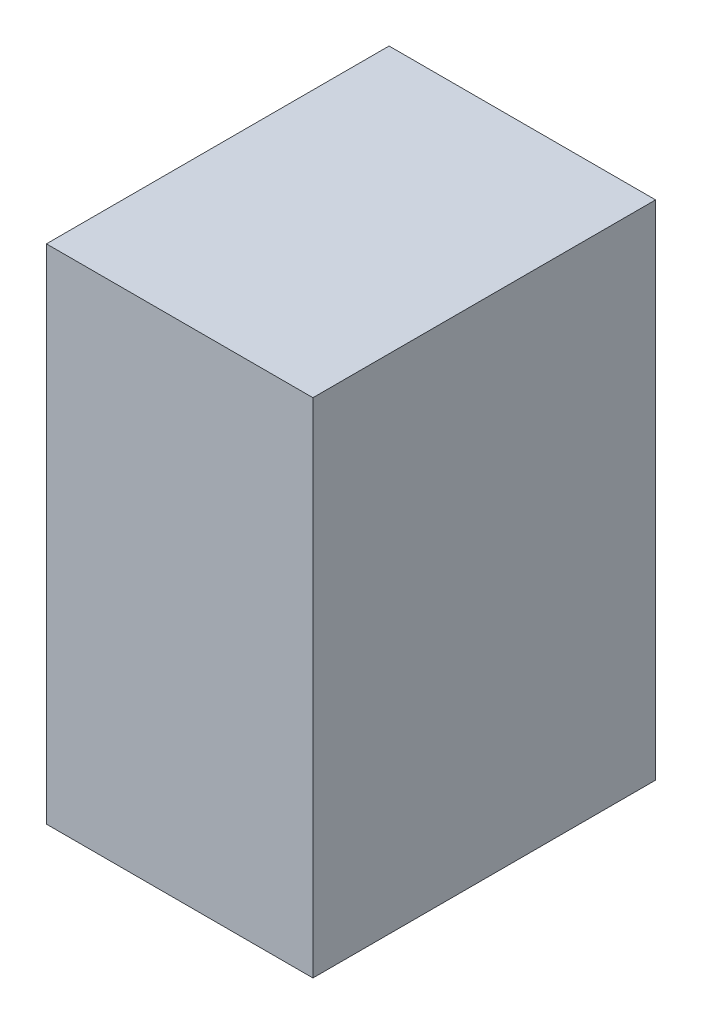
ISO-10303-21;
HEADER;
FILE_DESCRIPTION(('STEP AP214'),'2;1');
FILE_NAME('part.step','',(''),(''),'','','');
FILE_SCHEMA(('AUTOMOTIVE_DESIGN { 1 0 10303 214 1 1 1 1 }'));
ENDSEC;
DATA;
#1=APPLICATION_CONTEXT('core data for automotive mechanical design processes');
#2=APPLICATION_PROTOCOL_DEFINITION('international standard','automotive_design',2000,#1);
#3=PRODUCT_CONTEXT('',#1,'mechanical');
#4=PRODUCT('Part','Part','',(#3));
#5=PRODUCT_RELATED_PRODUCT_CATEGORY('part','',(#4));
#6=PRODUCT_DEFINITION_FORMATION('','',#4);
#7=PRODUCT_DEFINITION_CONTEXT('part definition',#1,'design');
#8=PRODUCT_DEFINITION('design','',#6,#7);
#9=PRODUCT_DEFINITION_SHAPE('','',#8);
#10=(LENGTH_UNIT() NAMED_UNIT(*) SI_UNIT(.MILLI.,.METRE.));
#11=(NAMED_UNIT(*) PLANE_ANGLE_UNIT() SI_UNIT($,.RADIAN.));
#12=(NAMED_UNIT(*) SI_UNIT($,.STERADIAN.) SOLID_ANGLE_UNIT());
#13=UNCERTAINTY_MEASURE_WITH_UNIT(LENGTH_MEASURE(1.E-05),#10,'distance_accuracy_value','');
#14=(GEOMETRIC_REPRESENTATION_CONTEXT(3) GLOBAL_UNCERTAINTY_ASSIGNED_CONTEXT((#13)) GLOBAL_UNIT_ASSIGNED_CONTEXT((#10,
#11,#12)) REPRESENTATION_CONTEXT('',''));
#15=CARTESIAN_POINT('',(0.,0.,0.));
#16=DIRECTION('',(0.,0.,1.));
#17=DIRECTION('',(1.,0.,0.));
#18=AXIS2_PLACEMENT_3D('',#15,#16,#17);
#19=CARTESIAN_POINT('',(16.25,-7.9,-0.5));
#20=DIRECTION('',(1.,0.,0.));
#21=DIRECTION('',(0.,1.,0.));
#22=AXIS2_PLACEMENT_3D('',#19,#20,#21);
#23=PLANE('',#22);
#24=DIRECTION('',(0.,0.,1.));
#25=VECTOR('',#24,1.);
#26=CARTESIAN_POINT('',(16.25,-8.1,-0.5));
#27=LINE('',#26,#25);
#28=CARTESIAN_POINT('',(16.25,-8.1,-4.5));
#29=VERTEX_POINT('',#28);
#30=CARTESIAN_POINT('',(16.25,-8.1,-0.5));
#31=VERTEX_POINT('',#30);
#32=EDGE_CURVE('E187',#29,#31,#27,.T.);
#33=ORIENTED_EDGE('',*,*,#32,.T.);
#34=DIRECTION('',(0.,1.,0.));
#35=VECTOR('',#34,1.);
#36=CARTESIAN_POINT('',(16.25,-7.9,-0.5));
#37=LINE('',#36,#35);
#38=CARTESIAN_POINT('',(16.25,-7.9,-0.5));
#39=VERTEX_POINT('',#38);
#40=EDGE_CURVE('E20',#39,#31,#37,.F.);
#41=ORIENTED_EDGE('',*,*,#40,.F.);
#42=DIRECTION('',(0.,0.,1.));
#43=VECTOR('',#42,1.);
#44=CARTESIAN_POINT('',(16.25,-7.9,-0.5));
#45=LINE('',#44,#43);
#46=CARTESIAN_POINT('',(16.25,-7.9,-4.5));
#47=VERTEX_POINT('',#46);
#48=EDGE_CURVE('E197',#39,#47,#45,.F.);
#49=ORIENTED_EDGE('',*,*,#48,.T.);
#50=DIRECTION('',(0.,1.,0.));
#51=VECTOR('',#50,1.);
#52=CARTESIAN_POINT('',(16.25,-7.9,-4.5));
#53=LINE('',#52,#51);
#54=EDGE_CURVE('E185',#29,#47,#53,.T.);
#55=ORIENTED_EDGE('',*,*,#54,.F.);
#56=EDGE_LOOP('',(#33,#41,#49,#55));
#57=FACE_BOUND('',#56,.T.);
#58=ADVANCED_FACE('F17',(#57),#23,.F.);
#59=CARTESIAN_POINT('',(16.25,-6.7,-0.5));
#60=DIRECTION('',(1.,0.,0.));
#61=DIRECTION('',(0.,1.,0.));
#62=AXIS2_PLACEMENT_3D('',#59,#60,#61);
#63=PLANE('',#62);
#64=DIRECTION('',(0.,0.,1.));
#65=VECTOR('',#64,1.);
#66=CARTESIAN_POINT('',(16.25,-6.9,-0.5));
#67=LINE('',#66,#65);
#68=CARTESIAN_POINT('',(16.25,-6.9,-4.5));
#69=VERTEX_POINT('',#68);
#70=CARTESIAN_POINT('',(16.25,-6.9,-0.5));
#71=VERTEX_POINT('',#70);
#72=EDGE_CURVE('E224',#69,#71,#67,.T.);
#73=ORIENTED_EDGE('',*,*,#72,.T.);
#74=DIRECTION('',(0.,1.,0.));
#75=VECTOR('',#74,1.);
#76=CARTESIAN_POINT('',(16.25,-6.7,-0.5));
#77=LINE('',#76,#75);
#78=CARTESIAN_POINT('',(16.25,-6.7,-0.5));
#79=VERTEX_POINT('',#78);
#80=EDGE_CURVE('E210',#79,#71,#77,.F.);
#81=ORIENTED_EDGE('',*,*,#80,.F.);
#82=DIRECTION('',(0.,0.,1.));
#83=VECTOR('',#82,1.);
#84=CARTESIAN_POINT('',(16.25,-6.7,-0.5));
#85=LINE('',#84,#83);
#86=CARTESIAN_POINT('',(16.25,-6.7,-4.5));
#87=VERTEX_POINT('',#86);
#88=EDGE_CURVE('E233',#79,#87,#85,.F.);
#89=ORIENTED_EDGE('',*,*,#88,.T.);
#90=DIRECTION('',(0.,1.,0.));
#91=VECTOR('',#90,1.);
#92=CARTESIAN_POINT('',(16.25,-6.7,-4.5));
#93=LINE('',#92,#91);
#94=EDGE_CURVE('E208',#69,#87,#93,.T.);
#95=ORIENTED_EDGE('',*,*,#94,.F.);
#96=EDGE_LOOP('',(#73,#81,#89,#95));
#97=FACE_BOUND('',#96,.T.);
#98=ADVANCED_FACE('F638',(#97),#63,.F.);
#99=CARTESIAN_POINT('',(16.25,-5.5,-0.5));
#100=DIRECTION('',(1.,0.,0.));
#101=DIRECTION('',(0.,1.,0.));
#102=AXIS2_PLACEMENT_3D('',#99,#100,#101);
#103=PLANE('',#102);
#104=DIRECTION('',(0.,0.,1.));
#105=VECTOR('',#104,1.);
#106=CARTESIAN_POINT('',(16.25,-5.7,-0.5));
#107=LINE('',#106,#105);
#108=CARTESIAN_POINT('',(16.25,-5.7,-4.5));
#109=VERTEX_POINT('',#108);
#110=CARTESIAN_POINT('',(16.25,-5.7,-0.5));
#111=VERTEX_POINT('',#110);
#112=EDGE_CURVE('E241',#109,#111,#107,.T.);
#113=ORIENTED_EDGE('',*,*,#112,.T.);
#114=DIRECTION('',(0.,1.,0.));
#115=VECTOR('',#114,1.);
#116=CARTESIAN_POINT('',(16.25,-5.5,-0.5));
#117=LINE('',#116,#115);
#118=CARTESIAN_POINT('',(16.25,-5.5,-0.5));
#119=VERTEX_POINT('',#118);
#120=EDGE_CURVE('E206',#119,#111,#117,.F.);
#121=ORIENTED_EDGE('',*,*,#120,.F.);
#122=DIRECTION('',(0.,0.,1.));
#123=VECTOR('',#122,1.);
#124=CARTESIAN_POINT('',(16.25,-5.5,-0.5));
#125=LINE('',#124,#123);
#126=CARTESIAN_POINT('',(16.25,-5.5,-4.5));
#127=VERTEX_POINT('',#126);
#128=EDGE_CURVE('E248',#119,#127,#125,.F.);
#129=ORIENTED_EDGE('',*,*,#128,.T.);
#130=DIRECTION('',(0.,1.,0.));
#131=VECTOR('',#130,1.);
#132=CARTESIAN_POINT('',(16.25,-5.5,-4.5));
#133=LINE('',#132,#131);
#134=EDGE_CURVE('E204',#109,#127,#133,.T.);
#135=ORIENTED_EDGE('',*,*,#134,.F.);
#136=EDGE_LOOP('',(#113,#121,#129,#135));
#137=FACE_BOUND('',#136,.T.);
#138=ADVANCED_FACE('F629',(#137),#103,.F.);
#139=CARTESIAN_POINT('',(16.25,-4.3,-0.5));
#140=DIRECTION('',(1.,0.,0.));
#141=DIRECTION('',(0.,1.,0.));
#142=AXIS2_PLACEMENT_3D('',#139,#140,#141);
#143=PLANE('',#142);
#144=DIRECTION('',(0.,0.,1.));
#145=VECTOR('',#144,1.);
#146=CARTESIAN_POINT('',(16.25,-4.5,-0.5));
#147=LINE('',#146,#145);
#148=CARTESIAN_POINT('',(16.25,-4.5,-4.5));
#149=VERTEX_POINT('',#148);
#150=CARTESIAN_POINT('',(16.25,-4.5,-0.5));
#151=VERTEX_POINT('',#150);
#152=EDGE_CURVE('E256',#149,#151,#147,.T.);
#153=ORIENTED_EDGE('',*,*,#152,.T.);
#154=DIRECTION('',(0.,1.,0.));
#155=VECTOR('',#154,1.);
#156=CARTESIAN_POINT('',(16.25,-4.3,-0.5));
#157=LINE('',#156,#155);
#158=CARTESIAN_POINT('',(16.25,-4.3,-0.5));
#159=VERTEX_POINT('',#158);
#160=EDGE_CURVE('E202',#159,#151,#157,.F.);
#161=ORIENTED_EDGE('',*,*,#160,.F.);
#162=DIRECTION('',(0.,0.,1.));
#163=VECTOR('',#162,1.);
#164=CARTESIAN_POINT('',(16.25,-4.3,-0.5));
#165=LINE('',#164,#163);
#166=CARTESIAN_POINT('',(16.25,-4.3,-4.5));
#167=VERTEX_POINT('',#166);
#168=EDGE_CURVE('E263',#159,#167,#165,.F.);
#169=ORIENTED_EDGE('',*,*,#168,.T.);
#170=DIRECTION('',(0.,1.,0.));
#171=VECTOR('',#170,1.);
#172=CARTESIAN_POINT('',(16.25,-4.3,-4.5));
#173=LINE('',#172,#171);
#174=EDGE_CURVE('E190',#149,#167,#173,.T.);
#175=ORIENTED_EDGE('',*,*,#174,.F.);
#176=EDGE_LOOP('',(#153,#161,#169,#175));
#177=FACE_BOUND('',#176,.T.);
#178=ADVANCED_FACE('F621',(#177),#143,.F.);
#179=CARTESIAN_POINT('',(16.25,-8.1,-0.5));
#180=DIRECTION('',(0.,1.,0.));
#181=DIRECTION('',(0.,0.,1.));
#182=AXIS2_PLACEMENT_3D('',#179,#180,#181);
#183=PLANE('',#182);
#184=DIRECTION('',(0.,0.,1.));
#185=VECTOR('',#184,1.);
#186=CARTESIAN_POINT('',(17.25,-8.1,-0.5));
#187=LINE('',#186,#185);
#188=CARTESIAN_POINT('',(17.25,-8.1,-4.5));
#189=VERTEX_POINT('',#188);
#190=CARTESIAN_POINT('',(17.25,-8.1,-0.5));
#191=VERTEX_POINT('',#190);
#192=EDGE_CURVE('E194',#189,#191,#187,.T.);
#193=ORIENTED_EDGE('',*,*,#192,.T.);
#194=DIRECTION('',(1.,0.,0.));
#195=VECTOR('',#194,1.);
#196=CARTESIAN_POINT('',(16.25,-8.1,-0.5));
#197=LINE('',#196,#195);
#198=EDGE_CURVE('E180',#31,#191,#197,.T.);
#199=ORIENTED_EDGE('',*,*,#198,.F.);
#200=ORIENTED_EDGE('',*,*,#32,.F.);
#201=DIRECTION('',(1.,0.,0.));
#202=VECTOR('',#201,1.);
#203=CARTESIAN_POINT('',(0.,-8.1,-4.5));
#204=LINE('',#203,#202);
#205=EDGE_CURVE('E218',#29,#189,#204,.T.);
#206=ORIENTED_EDGE('',*,*,#205,.T.);
#207=EDGE_LOOP('',(#193,#199,#200,#206));
#208=FACE_BOUND('',#207,.T.);
#209=ADVANCED_FACE('F192',(#208),#183,.F.);
#210=CARTESIAN_POINT('',(17.25,-7.9,-0.5));
#211=DIRECTION('',(0.,-1.,0.));
#212=DIRECTION('',(1.,0.,0.));
#213=AXIS2_PLACEMENT_3D('',#210,#211,#212);
#214=PLANE('',#213);
#215=ORIENTED_EDGE('',*,*,#48,.F.);
#216=DIRECTION('',(1.,0.,0.));
#217=VECTOR('',#216,1.);
#218=CARTESIAN_POINT('',(17.25,-7.9,-0.5));
#219=LINE('',#218,#217);
#220=CARTESIAN_POINT('',(17.25,-7.9,-0.5));
#221=VERTEX_POINT('',#220);
#222=EDGE_CURVE('E175',#221,#39,#219,.F.);
#223=ORIENTED_EDGE('',*,*,#222,.F.);
#224=DIRECTION('',(0.,0.,1.));
#225=VECTOR('',#224,1.);
#226=CARTESIAN_POINT('',(17.25,-7.9,-0.5));
#227=LINE('',#226,#225);
#228=CARTESIAN_POINT('',(17.25,-7.9,-4.5));
#229=VERTEX_POINT('',#228);
#230=EDGE_CURVE('E222',#221,#229,#227,.F.);
#231=ORIENTED_EDGE('',*,*,#230,.T.);
#232=DIRECTION('',(1.,0.,0.));
#233=VECTOR('',#232,1.);
#234=CARTESIAN_POINT('',(0.,-7.9,-4.5));
#235=LINE('',#234,#233);
#236=EDGE_CURVE('E216',#229,#47,#235,.F.);
#237=ORIENTED_EDGE('',*,*,#236,.T.);
#238=EDGE_LOOP('',(#215,#223,#231,#237));
#239=FACE_BOUND('',#238,.T.);
#240=ADVANCED_FACE('F220',(#239),#214,.F.);
#241=CARTESIAN_POINT('',(0.,0.,-4.5));
#242=DIRECTION('',(0.,0.,1.));
#243=DIRECTION('',(1.,0.,0.));
#244=AXIS2_PLACEMENT_3D('',#241,#242,#243);
#245=PLANE('',#244);
#246=ORIENTED_EDGE('',*,*,#205,.F.);
#247=ORIENTED_EDGE('',*,*,#54,.T.);
#248=ORIENTED_EDGE('',*,*,#236,.F.);
#249=DIRECTION('',(0.,-1.,0.));
#250=VECTOR('',#249,1.);
#251=CARTESIAN_POINT('',(17.25,-8.1,-4.5));
#252=LINE('',#251,#250);
#253=EDGE_CURVE('E273',#229,#189,#252,.T.);
#254=ORIENTED_EDGE('',*,*,#253,.T.);
#255=EDGE_LOOP('',(#246,#247,#248,#254));
#256=FACE_BOUND('',#255,.T.);
#257=ADVANCED_FACE('F213',(#256),#245,.F.);
#258=CARTESIAN_POINT('',(16.25,-6.9,-0.5));
#259=DIRECTION('',(0.,1.,0.));
#260=DIRECTION('',(-1.,0.,0.));
#261=AXIS2_PLACEMENT_3D('',#258,#259,#260);
#262=PLANE('',#261);
#263=DIRECTION('',(0.,0.,1.));
#264=VECTOR('',#263,1.);
#265=CARTESIAN_POINT('',(17.25,-6.9,-0.5));
#266=LINE('',#265,#264);
#267=CARTESIAN_POINT('',(17.25,-6.9,-4.5));
#268=VERTEX_POINT('',#267);
#269=CARTESIAN_POINT('',(17.25,-6.9,-0.5));
#270=VERTEX_POINT('',#269);
#271=EDGE_CURVE('E275',#268,#270,#266,.T.);
#272=ORIENTED_EDGE('',*,*,#271,.T.);
#273=DIRECTION('',(-1.,0.,0.));
#274=VECTOR('',#273,1.);
#275=CARTESIAN_POINT('',(16.25,-6.9,-0.5));
#276=LINE('',#275,#274);
#277=EDGE_CURVE('E229',#71,#270,#276,.F.);
#278=ORIENTED_EDGE('',*,*,#277,.F.);
#279=ORIENTED_EDGE('',*,*,#72,.F.);
#280=DIRECTION('',(1.,0.,0.));
#281=VECTOR('',#280,1.);
#282=CARTESIAN_POINT('',(0.,-6.9,-4.5));
#283=LINE('',#282,#281);
#284=EDGE_CURVE('E239',#69,#268,#283,.T.);
#285=ORIENTED_EDGE('',*,*,#284,.T.);
#286=EDGE_LOOP('',(#272,#278,#279,#285));
#287=FACE_BOUND('',#286,.T.);
#288=ADVANCED_FACE('F590',(#287),#262,.F.);
#289=CARTESIAN_POINT('',(17.25,-6.7,-0.5));
#290=DIRECTION('',(0.,-1.,0.));
#291=DIRECTION('',(1.,0.,0.));
#292=AXIS2_PLACEMENT_3D('',#289,#290,#291);
#293=PLANE('',#292);
#294=ORIENTED_EDGE('',*,*,#88,.F.);
#295=DIRECTION('',(1.,0.,0.));
#296=VECTOR('',#295,1.);
#297=CARTESIAN_POINT('',(17.25,-6.7,-0.5));
#298=LINE('',#297,#296);
#299=CARTESIAN_POINT('',(17.25,-6.7,-0.5));
#300=VERTEX_POINT('',#299);
#301=EDGE_CURVE('E231',#300,#79,#298,.F.);
#302=ORIENTED_EDGE('',*,*,#301,.F.);
#303=DIRECTION('',(0.,0.,1.));
#304=VECTOR('',#303,1.);
#305=CARTESIAN_POINT('',(17.25,-6.7,-0.5));
#306=LINE('',#305,#304);
#307=CARTESIAN_POINT('',(17.25,-6.7,-4.5));
#308=VERTEX_POINT('',#307);
#309=EDGE_CURVE('E278',#300,#308,#306,.F.);
#310=ORIENTED_EDGE('',*,*,#309,.T.);
#311=DIRECTION('',(1.,0.,0.));
#312=VECTOR('',#311,1.);
#313=CARTESIAN_POINT('',(0.,-6.7,-4.5));
#314=LINE('',#313,#312);
#315=EDGE_CURVE('E236',#308,#87,#314,.F.);
#316=ORIENTED_EDGE('',*,*,#315,.T.);
#317=EDGE_LOOP('',(#294,#302,#310,#316));
#318=FACE_BOUND('',#317,.T.);
#319=ADVANCED_FACE('F581',(#318),#293,.F.);
#320=CARTESIAN_POINT('',(0.,0.,-4.5));
#321=DIRECTION('',(0.,0.,1.));
#322=DIRECTION('',(1.,0.,0.));
#323=AXIS2_PLACEMENT_3D('',#320,#321,#322);
#324=PLANE('',#323);
#325=ORIENTED_EDGE('',*,*,#284,.F.);
#326=ORIENTED_EDGE('',*,*,#94,.T.);
#327=ORIENTED_EDGE('',*,*,#315,.F.);
#328=DIRECTION('',(0.,-1.,0.));
#329=VECTOR('',#328,1.);
#330=CARTESIAN_POINT('',(17.25,-6.9,-4.5));
#331=LINE('',#330,#329);
#332=EDGE_CURVE('E280',#308,#268,#331,.T.);
#333=ORIENTED_EDGE('',*,*,#332,.T.);
#334=EDGE_LOOP('',(#325,#326,#327,#333));
#335=FACE_BOUND('',#334,.T.);
#336=ADVANCED_FACE('F572',(#335),#324,.F.);
#337=CARTESIAN_POINT('',(16.25,-5.7,-0.5));
#338=DIRECTION('',(0.,1.,0.));
#339=DIRECTION('',(-1.,0.,0.));
#340=AXIS2_PLACEMENT_3D('',#337,#338,#339);
#341=PLANE('',#340);
#342=DIRECTION('',(0.,0.,1.));
#343=VECTOR('',#342,1.);
#344=CARTESIAN_POINT('',(17.25,-5.7,-0.5));
#345=LINE('',#344,#343);
#346=CARTESIAN_POINT('',(17.25,-5.7,-4.5));
#347=VERTEX_POINT('',#346);
#348=CARTESIAN_POINT('',(17.25,-5.7,-0.5));
#349=VERTEX_POINT('',#348);
#350=EDGE_CURVE('E283',#347,#349,#345,.T.);
#351=ORIENTED_EDGE('',*,*,#350,.T.);
#352=DIRECTION('',(-1.,0.,0.));
#353=VECTOR('',#352,1.);
#354=CARTESIAN_POINT('',(16.25,-5.7,-0.5));
#355=LINE('',#354,#353);
#356=EDGE_CURVE('E244',#111,#349,#355,.F.);
#357=ORIENTED_EDGE('',*,*,#356,.F.);
#358=ORIENTED_EDGE('',*,*,#112,.F.);
#359=DIRECTION('',(1.,0.,0.));
#360=VECTOR('',#359,1.);
#361=CARTESIAN_POINT('',(0.,-5.7,-4.5));
#362=LINE('',#361,#360);
#363=EDGE_CURVE('E254',#109,#347,#362,.T.);
#364=ORIENTED_EDGE('',*,*,#363,.T.);
#365=EDGE_LOOP('',(#351,#357,#358,#364));
#366=FACE_BOUND('',#365,.T.);
#367=ADVANCED_FACE('F563',(#366),#341,.F.);
#368=CARTESIAN_POINT('',(17.25,-5.5,-0.5));
#369=DIRECTION('',(0.,-1.,0.));
#370=DIRECTION('',(1.,0.,0.));
#371=AXIS2_PLACEMENT_3D('',#368,#369,#370);
#372=PLANE('',#371);
#373=ORIENTED_EDGE('',*,*,#128,.F.);
#374=DIRECTION('',(1.,0.,0.));
#375=VECTOR('',#374,1.);
#376=CARTESIAN_POINT('',(17.25,-5.5,-0.5));
#377=LINE('',#376,#375);
#378=CARTESIAN_POINT('',(17.25,-5.5,-0.5));
#379=VERTEX_POINT('',#378);
#380=EDGE_CURVE('E246',#379,#119,#377,.F.);
#381=ORIENTED_EDGE('',*,*,#380,.F.);
#382=DIRECTION('',(0.,0.,1.));
#383=VECTOR('',#382,1.);
#384=CARTESIAN_POINT('',(17.25,-5.5,-0.5));
#385=LINE('',#384,#383);
#386=CARTESIAN_POINT('',(17.25,-5.5,-4.5));
#387=VERTEX_POINT('',#386);
#388=EDGE_CURVE('E286',#379,#387,#385,.F.);
#389=ORIENTED_EDGE('',*,*,#388,.T.);
#390=DIRECTION('',(1.,0.,0.));
#391=VECTOR('',#390,1.);
#392=CARTESIAN_POINT('',(0.,-5.5,-4.5));
#393=LINE('',#392,#391);
#394=EDGE_CURVE('E251',#387,#127,#393,.F.);
#395=ORIENTED_EDGE('',*,*,#394,.T.);
#396=EDGE_LOOP('',(#373,#381,#389,#395));
#397=FACE_BOUND('',#396,.T.);
#398=ADVANCED_FACE('F554',(#397),#372,.F.);
#399=CARTESIAN_POINT('',(0.,0.,-4.5));
#400=DIRECTION('',(0.,0.,1.));
#401=DIRECTION('',(1.,0.,0.));
#402=AXIS2_PLACEMENT_3D('',#399,#400,#401);
#403=PLANE('',#402);
#404=ORIENTED_EDGE('',*,*,#363,.F.);
#405=ORIENTED_EDGE('',*,*,#134,.T.);
#406=ORIENTED_EDGE('',*,*,#394,.F.);
#407=DIRECTION('',(0.,-1.,0.));
#408=VECTOR('',#407,1.);
#409=CARTESIAN_POINT('',(17.25,-5.7,-4.5));
#410=LINE('',#409,#408);
#411=EDGE_CURVE('E288',#387,#347,#410,.T.);
#412=ORIENTED_EDGE('',*,*,#411,.T.);
#413=EDGE_LOOP('',(#404,#405,#406,#412));
#414=FACE_BOUND('',#413,.T.);
#415=ADVANCED_FACE('F545',(#414),#403,.F.);
#416=CARTESIAN_POINT('',(16.25,-4.5,-0.5));
#417=DIRECTION('',(0.,1.,0.));
#418=DIRECTION('',(-1.,0.,0.));
#419=AXIS2_PLACEMENT_3D('',#416,#417,#418);
#420=PLANE('',#419);
#421=DIRECTION('',(0.,0.,1.));
#422=VECTOR('',#421,1.);
#423=CARTESIAN_POINT('',(17.25,-4.5,-0.5));
#424=LINE('',#423,#422);
#425=CARTESIAN_POINT('',(17.25,-4.5,-4.5));
#426=VERTEX_POINT('',#425);
#427=CARTESIAN_POINT('',(17.25,-4.5,-0.5));
#428=VERTEX_POINT('',#427);
#429=EDGE_CURVE('E291',#426,#428,#424,.T.);
#430=ORIENTED_EDGE('',*,*,#429,.T.);
#431=DIRECTION('',(-1.,0.,0.));
#432=VECTOR('',#431,1.);
#433=CARTESIAN_POINT('',(16.25,-4.5,-0.5));
#434=LINE('',#433,#432);
#435=EDGE_CURVE('E259',#151,#428,#434,.F.);
#436=ORIENTED_EDGE('',*,*,#435,.F.);
#437=ORIENTED_EDGE('',*,*,#152,.F.);
#438=DIRECTION('',(1.,0.,0.));
#439=VECTOR('',#438,1.);
#440=CARTESIAN_POINT('',(0.,-4.5,-4.5));
#441=LINE('',#440,#439);
#442=EDGE_CURVE('E269',#149,#426,#441,.T.);
#443=ORIENTED_EDGE('',*,*,#442,.T.);
#444=EDGE_LOOP('',(#430,#436,#437,#443));
#445=FACE_BOUND('',#444,.T.);
#446=ADVANCED_FACE('F536',(#445),#420,.F.);
#447=CARTESIAN_POINT('',(17.25,-4.3,-0.5));
#448=DIRECTION('',(0.,-1.,0.));
#449=DIRECTION('',(1.,0.,0.));
#450=AXIS2_PLACEMENT_3D('',#447,#448,#449);
#451=PLANE('',#450);
#452=ORIENTED_EDGE('',*,*,#168,.F.);
#453=DIRECTION('',(1.,0.,0.));
#454=VECTOR('',#453,1.);
#455=CARTESIAN_POINT('',(17.25,-4.3,-0.5));
#456=LINE('',#455,#454);
#457=CARTESIAN_POINT('',(17.25,-4.3,-0.5));
#458=VERTEX_POINT('',#457);
#459=EDGE_CURVE('E261',#458,#159,#456,.F.);
#460=ORIENTED_EDGE('',*,*,#459,.F.);
#461=DIRECTION('',(0.,0.,1.));
#462=VECTOR('',#461,1.);
#463=CARTESIAN_POINT('',(17.25,-4.3,-0.5));
#464=LINE('',#463,#462);
#465=CARTESIAN_POINT('',(17.25,-4.3,-4.5));
#466=VERTEX_POINT('',#465);
#467=EDGE_CURVE('E294',#458,#466,#464,.F.);
#468=ORIENTED_EDGE('',*,*,#467,.T.);
#469=DIRECTION('',(1.,0.,0.));
#470=VECTOR('',#469,1.);
#471=CARTESIAN_POINT('',(0.,-4.3,-4.5));
#472=LINE('',#471,#470);
#473=EDGE_CURVE('E266',#466,#167,#472,.F.);
#474=ORIENTED_EDGE('',*,*,#473,.T.);
#475=EDGE_LOOP('',(#452,#460,#468,#474));
#476=FACE_BOUND('',#475,.T.);
#477=ADVANCED_FACE('F527',(#476),#451,.F.);
#478=CARTESIAN_POINT('',(0.,0.,-4.5));
#479=DIRECTION('',(0.,0.,1.));
#480=DIRECTION('',(1.,0.,0.));
#481=AXIS2_PLACEMENT_3D('',#478,#479,#480);
#482=PLANE('',#481);
#483=ORIENTED_EDGE('',*,*,#442,.F.);
#484=ORIENTED_EDGE('',*,*,#174,.T.);
#485=ORIENTED_EDGE('',*,*,#473,.F.);
#486=DIRECTION('',(0.,1.,0.));
#487=VECTOR('',#486,1.);
#488=CARTESIAN_POINT('',(17.25,-4.5,-4.5));
#489=LINE('',#488,#487);
#490=EDGE_CURVE('E296',#466,#426,#489,.F.);
#491=ORIENTED_EDGE('',*,*,#490,.T.);
#492=EDGE_LOOP('',(#483,#484,#485,#491));
#493=FACE_BOUND('',#492,.T.);
#494=ADVANCED_FACE('F518',(#493),#482,.F.);
#495=CARTESIAN_POINT('',(17.25,-8.1,-0.5));
#496=DIRECTION('',(-1.,0.,0.));
#497=DIRECTION('',(0.,-1.,0.));
#498=AXIS2_PLACEMENT_3D('',#495,#496,#497);
#499=PLANE('',#498);
#500=ORIENTED_EDGE('',*,*,#230,.F.);
#501=DIRECTION('',(0.,1.,0.));
#502=VECTOR('',#501,1.);
#503=CARTESIAN_POINT('',(17.25,-6.2,-0.5));
#504=LINE('',#503,#502);
#505=EDGE_CURVE('E299',#221,#191,#504,.F.);
#506=ORIENTED_EDGE('',*,*,#505,.T.);
#507=ORIENTED_EDGE('',*,*,#192,.F.);
#508=ORIENTED_EDGE('',*,*,#253,.F.);
#509=EDGE_LOOP('',(#500,#506,#507,#508));
#510=FACE_BOUND('',#509,.T.);
#511=ADVANCED_FACE('F509',(#510),#499,.F.);
#512=CARTESIAN_POINT('',(17.25,-6.9,-0.5));
#513=DIRECTION('',(-1.,0.,0.));
#514=DIRECTION('',(0.,-1.,0.));
#515=AXIS2_PLACEMENT_3D('',#512,#513,#514);
#516=PLANE('',#515);
#517=ORIENTED_EDGE('',*,*,#309,.F.);
#518=DIRECTION('',(0.,1.,0.));
#519=VECTOR('',#518,1.);
#520=CARTESIAN_POINT('',(17.25,-6.2,-0.5));
#521=LINE('',#520,#519);
#522=EDGE_CURVE('E301',#300,#270,#521,.F.);
#523=ORIENTED_EDGE('',*,*,#522,.T.);
#524=ORIENTED_EDGE('',*,*,#271,.F.);
#525=ORIENTED_EDGE('',*,*,#332,.F.);
#526=EDGE_LOOP('',(#517,#523,#524,#525));
#527=FACE_BOUND('',#526,.T.);
#528=ADVANCED_FACE('F500',(#527),#516,.F.);
#529=CARTESIAN_POINT('',(17.25,-5.7,-0.5));
#530=DIRECTION('',(-1.,0.,0.));
#531=DIRECTION('',(0.,-1.,0.));
#532=AXIS2_PLACEMENT_3D('',#529,#530,#531);
#533=PLANE('',#532);
#534=ORIENTED_EDGE('',*,*,#388,.F.);
#535=DIRECTION('',(0.,1.,0.));
#536=VECTOR('',#535,1.);
#537=CARTESIAN_POINT('',(17.25,-6.2,-0.5));
#538=LINE('',#537,#536);
#539=EDGE_CURVE('E304',#379,#349,#538,.F.);
#540=ORIENTED_EDGE('',*,*,#539,.T.);
#541=ORIENTED_EDGE('',*,*,#350,.F.);
#542=ORIENTED_EDGE('',*,*,#411,.F.);
#543=EDGE_LOOP('',(#534,#540,#541,#542));
#544=FACE_BOUND('',#543,.T.);
#545=ADVANCED_FACE('F491',(#544),#533,.F.);
#546=CARTESIAN_POINT('',(17.25,-4.5,-0.5));
#547=DIRECTION('',(-1.,0.,0.));
#548=DIRECTION('',(0.,0.,1.));
#549=AXIS2_PLACEMENT_3D('',#546,#547,#548);
#550=PLANE('',#549);
#551=ORIENTED_EDGE('',*,*,#467,.F.);
#552=DIRECTION('',(0.,1.,0.));
#553=VECTOR('',#552,1.);
#554=CARTESIAN_POINT('',(17.25,-6.2,-0.5));
#555=LINE('',#554,#553);
#556=EDGE_CURVE('E307',#458,#428,#555,.F.);
#557=ORIENTED_EDGE('',*,*,#556,.T.);
#558=ORIENTED_EDGE('',*,*,#429,.F.);
#559=ORIENTED_EDGE('',*,*,#490,.F.);
#560=EDGE_LOOP('',(#551,#557,#558,#559));
#561=FACE_BOUND('',#560,.T.);
#562=ADVANCED_FACE('F482',(#561),#550,.F.);
#563=CARTESIAN_POINT('',(16.75,-6.2,-0.5));
#564=DIRECTION('',(0.,0.,1.));
#565=DIRECTION('',(1.,0.,0.));
#566=AXIS2_PLACEMENT_3D('',#563,#564,#565);
#567=PLANE('',#566);
#568=DIRECTION('',(-1.,0.,0.));
#569=VECTOR('',#568,1.);
#570=CARTESIAN_POINT('',(15.5,-9.,-0.5));
#571=LINE('',#570,#569);
#572=CARTESIAN_POINT('',(15.5,-9.,-0.5));
#573=VERTEX_POINT('',#572);
#574=CARTESIAN_POINT('',(18.,-9.,-0.5));
#575=VERTEX_POINT('',#574);
#576=EDGE_CURVE('E327',#573,#575,#571,.F.);
#577=ORIENTED_EDGE('',*,*,#576,.F.);
#578=DIRECTION('',(0.,1.,0.));
#579=VECTOR('',#578,1.);
#580=CARTESIAN_POINT('',(15.5,-3.4,-0.5));
#581=LINE('',#580,#579);
#582=CARTESIAN_POINT('',(15.5,-3.4,-0.5));
#583=VERTEX_POINT('',#582);
#584=EDGE_CURVE('E310',#583,#573,#581,.F.);
#585=ORIENTED_EDGE('',*,*,#584,.F.);
#586=DIRECTION('',(1.,0.,0.));
#587=VECTOR('',#586,1.);
#588=CARTESIAN_POINT('',(18.,-3.4,-0.5));
#589=LINE('',#588,#587);
#590=CARTESIAN_POINT('',(18.,-3.4,-0.5));
#591=VERTEX_POINT('',#590);
#592=EDGE_CURVE('E312',#591,#583,#589,.F.);
#593=ORIENTED_EDGE('',*,*,#592,.F.);
#594=DIRECTION('',(0.,1.,0.));
#595=VECTOR('',#594,1.);
#596=CARTESIAN_POINT('',(18.,-9.,-0.5));
#597=LINE('',#596,#595);
#598=EDGE_CURVE('E318',#575,#591,#597,.T.);
#599=ORIENTED_EDGE('',*,*,#598,.F.);
#600=EDGE_LOOP('',(#577,#585,#593,#599));
#601=FACE_BOUND('',#600,.T.);
#602=ORIENTED_EDGE('',*,*,#459,.T.);
#603=ORIENTED_EDGE('',*,*,#160,.T.);
#604=ORIENTED_EDGE('',*,*,#435,.T.);
#605=ORIENTED_EDGE('',*,*,#556,.F.);
#606=EDGE_LOOP('',(#602,#603,#604,#605));
#607=FACE_BOUND('',#606,.T.);
#608=ORIENTED_EDGE('',*,*,#380,.T.);
#609=ORIENTED_EDGE('',*,*,#120,.T.);
#610=ORIENTED_EDGE('',*,*,#356,.T.);
#611=ORIENTED_EDGE('',*,*,#539,.F.);
#612=EDGE_LOOP('',(#608,#609,#610,#611));
#613=FACE_BOUND('',#612,.T.);
#614=ORIENTED_EDGE('',*,*,#301,.T.);
#615=ORIENTED_EDGE('',*,*,#80,.T.);
#616=ORIENTED_EDGE('',*,*,#277,.T.);
#617=ORIENTED_EDGE('',*,*,#522,.F.);
#618=EDGE_LOOP('',(#614,#615,#616,#617));
#619=FACE_BOUND('',#618,.T.);
#620=ORIENTED_EDGE('',*,*,#222,.T.);
#621=ORIENTED_EDGE('',*,*,#40,.T.);
#622=ORIENTED_EDGE('',*,*,#198,.T.);
#623=ORIENTED_EDGE('',*,*,#505,.F.);
#624=EDGE_LOOP('',(#620,#621,#622,#623));
#625=FACE_BOUND('',#624,.T.);
#626=ADVANCED_FACE('F178',(#601,#607,#613,#619,#625),#567,.F.);
#627=CARTESIAN_POINT('',(15.5,-3.4,-0.5));
#628=DIRECTION('',(1.,0.,0.));
#629=DIRECTION('',(0.,1.,0.));
#630=AXIS2_PLACEMENT_3D('',#627,#628,#629);
#631=PLANE('',#630);
#632=ORIENTED_EDGE('',*,*,#584,.T.);
#633=DIRECTION('',(0.,0.,1.));
#634=VECTOR('',#633,1.);
#635=CARTESIAN_POINT('',(15.5,-9.,-0.5));
#636=LINE('',#635,#634);
#637=CARTESIAN_POINT('',(15.5,-9.,-4.5));
#638=VERTEX_POINT('',#637);
#639=EDGE_CURVE('E324',#638,#573,#636,.T.);
#640=ORIENTED_EDGE('',*,*,#639,.F.);
#641=DIRECTION('',(0.,1.,0.));
#642=VECTOR('',#641,1.);
#643=CARTESIAN_POINT('',(15.5,0.,-4.5));
#644=LINE('',#643,#642);
#645=CARTESIAN_POINT('',(15.5,-3.4,-4.5));
#646=VERTEX_POINT('',#645);
#647=EDGE_CURVE('E341',#638,#646,#644,.T.);
#648=ORIENTED_EDGE('',*,*,#647,.T.);
#649=DIRECTION('',(0.,0.,1.));
#650=VECTOR('',#649,1.);
#651=CARTESIAN_POINT('',(15.5,-3.4,-0.5));
#652=LINE('',#651,#650);
#653=EDGE_CURVE('E315',#583,#646,#652,.F.);
#654=ORIENTED_EDGE('',*,*,#653,.F.);
#655=EDGE_LOOP('',(#632,#640,#648,#654));
#656=FACE_BOUND('',#655,.T.);
#657=ADVANCED_FACE('F465',(#656),#631,.T.);
#658=CARTESIAN_POINT('',(18.,-3.4,-0.5));
#659=DIRECTION('',(0.,-1.,0.));
#660=DIRECTION('',(1.,0.,0.));
#661=AXIS2_PLACEMENT_3D('',#658,#659,#660);
#662=PLANE('',#661);
#663=ORIENTED_EDGE('',*,*,#592,.T.);
#664=ORIENTED_EDGE('',*,*,#653,.T.);
#665=DIRECTION('',(1.,0.,0.));
#666=VECTOR('',#665,1.);
#667=CARTESIAN_POINT('',(0.,-3.4,-4.5));
#668=LINE('',#667,#666);
#669=CARTESIAN_POINT('',(18.,-3.4,-4.5));
#670=VERTEX_POINT('',#669);
#671=EDGE_CURVE('E343',#646,#670,#668,.T.);
#672=ORIENTED_EDGE('',*,*,#671,.T.);
#673=DIRECTION('',(0.,0.,1.));
#674=VECTOR('',#673,1.);
#675=CARTESIAN_POINT('',(18.,-3.4,-0.5));
#676=LINE('',#675,#674);
#677=EDGE_CURVE('E321',#591,#670,#676,.F.);
#678=ORIENTED_EDGE('',*,*,#677,.F.);
#679=EDGE_LOOP('',(#663,#664,#672,#678));
#680=FACE_BOUND('',#679,.T.);
#681=ADVANCED_FACE('F456',(#680),#662,.T.);
#682=CARTESIAN_POINT('',(18.,-9.,-0.5));
#683=DIRECTION('',(-1.,0.,0.));
#684=DIRECTION('',(0.,0.,1.));
#685=AXIS2_PLACEMENT_3D('',#682,#683,#684);
#686=PLANE('',#685);
#687=ORIENTED_EDGE('',*,*,#598,.T.);
#688=ORIENTED_EDGE('',*,*,#677,.T.);
#689=DIRECTION('',(0.,1.,0.));
#690=VECTOR('',#689,1.);
#691=CARTESIAN_POINT('',(18.,0.,-4.5));
#692=LINE('',#691,#690);
#693=CARTESIAN_POINT('',(18.,-9.,-4.5));
#694=VERTEX_POINT('',#693);
#695=EDGE_CURVE('E345',#670,#694,#692,.F.);
#696=ORIENTED_EDGE('',*,*,#695,.T.);
#697=DIRECTION('',(0.,0.,1.));
#698=VECTOR('',#697,1.);
#699=CARTESIAN_POINT('',(18.,-9.,-0.5));
#700=LINE('',#699,#698);
#701=EDGE_CURVE('E330',#575,#694,#700,.F.);
#702=ORIENTED_EDGE('',*,*,#701,.F.);
#703=EDGE_LOOP('',(#687,#688,#696,#702));
#704=FACE_BOUND('',#703,.T.);
#705=ADVANCED_FACE('F447',(#704),#686,.T.);
#706=CARTESIAN_POINT('',(15.5,-9.,-0.5));
#707=DIRECTION('',(0.,1.,0.));
#708=DIRECTION('',(-1.,0.,0.));
#709=AXIS2_PLACEMENT_3D('',#706,#707,#708);
#710=PLANE('',#709);
#711=ORIENTED_EDGE('',*,*,#576,.T.);
#712=ORIENTED_EDGE('',*,*,#701,.T.);
#713=DIRECTION('',(1.,0.,0.));
#714=VECTOR('',#713,1.);
#715=CARTESIAN_POINT('',(0.,-9.,-4.5));
#716=LINE('',#715,#714);
#717=EDGE_CURVE('E347',#694,#638,#716,.F.);
#718=ORIENTED_EDGE('',*,*,#717,.T.);
#719=ORIENTED_EDGE('',*,*,#639,.T.);
#720=EDGE_LOOP('',(#711,#712,#718,#719));
#721=FACE_BOUND('',#720,.T.);
#722=ADVANCED_FACE('F393',(#721),#710,.T.);
#723=CARTESIAN_POINT('',(15.,-2.9,-4.5));
#724=DIRECTION('',(-1.,0.,0.));
#725=DIRECTION('',(0.,-1.,0.));
#726=AXIS2_PLACEMENT_3D('',#723,#724,#725);
#727=PLANE('',#726);
#728=DIRECTION('',(0.,1.,0.));
#729=VECTOR('',#728,1.);
#730=CARTESIAN_POINT('',(15.,0.,-4.5));
#731=LINE('',#730,#729);
#732=CARTESIAN_POINT('',(15.,-2.9,-4.5));
#733=VERTEX_POINT('',#732);
#734=CARTESIAN_POINT('',(15.,-9.5,-4.5));
#735=VERTEX_POINT('',#734);
#736=EDGE_CURVE('E350',#733,#735,#731,.F.);
#737=ORIENTED_EDGE('',*,*,#736,.T.);
#738=DIRECTION('',(0.,0.,1.));
#739=VECTOR('',#738,1.);
#740=CARTESIAN_POINT('',(15.,-9.5,-4.5));
#741=LINE('',#740,#739);
#742=CARTESIAN_POINT('',(15.,-9.5,0.));
#743=VERTEX_POINT('',#742);
#744=EDGE_CURVE('E338',#743,#735,#741,.F.);
#745=ORIENTED_EDGE('',*,*,#744,.F.);
#746=DIRECTION('',(0.,1.,0.));
#747=VECTOR('',#746,1.);
#748=CARTESIAN_POINT('',(15.,0.,0.));
#749=LINE('',#748,#747);
#750=CARTESIAN_POINT('',(15.,-2.9,0.));
#751=VERTEX_POINT('',#750);
#752=EDGE_CURVE('E333',#751,#743,#749,.F.);
#753=ORIENTED_EDGE('',*,*,#752,.F.);
#754=DIRECTION('',(0.,0.,1.));
#755=VECTOR('',#754,1.);
#756=CARTESIAN_POINT('',(15.,-2.9,-4.5));
#757=LINE('',#756,#755);
#758=EDGE_CURVE('E358',#733,#751,#757,.T.);
#759=ORIENTED_EDGE('',*,*,#758,.F.);
#760=EDGE_LOOP('',(#737,#745,#753,#759));
#761=FACE_BOUND('',#760,.T.);
#762=ADVANCED_FACE('F379',(#761),#727,.T.);
#763=CARTESIAN_POINT('',(0.,0.,0.));
#764=DIRECTION('',(0.,0.,1.));
#765=DIRECTION('',(1.,0.,0.));
#766=AXIS2_PLACEMENT_3D('',#763,#764,#765);
#767=PLANE('',#766);
#768=ORIENTED_EDGE('',*,*,#752,.T.);
#769=DIRECTION('',(1.,0.,0.));
#770=VECTOR('',#769,1.);
#771=CARTESIAN_POINT('',(15.,-9.5,0.));
#772=LINE('',#771,#770);
#773=CARTESIAN_POINT('',(18.5,-9.5,0.));
#774=VERTEX_POINT('',#773);
#775=EDGE_CURVE('E335',#774,#743,#772,.F.);
#776=ORIENTED_EDGE('',*,*,#775,.F.);
#777=DIRECTION('',(0.,1.,0.));
#778=VECTOR('',#777,1.);
#779=CARTESIAN_POINT('',(18.5,-9.5,0.));
#780=LINE('',#779,#778);
#781=CARTESIAN_POINT('',(18.5,-2.9,0.));
#782=VERTEX_POINT('',#781);
#783=EDGE_CURVE('E361',#782,#774,#780,.F.);
#784=ORIENTED_EDGE('',*,*,#783,.F.);
#785=DIRECTION('',(-1.,0.,0.));
#786=VECTOR('',#785,1.);
#787=CARTESIAN_POINT('',(18.5,-2.9,0.));
#788=LINE('',#787,#786);
#789=EDGE_CURVE('E354',#751,#782,#788,.F.);
#790=ORIENTED_EDGE('',*,*,#789,.F.);
#791=EDGE_LOOP('',(#768,#776,#784,#790));
#792=FACE_BOUND('',#791,.T.);
#793=ADVANCED_FACE('F384',(#792),#767,.T.);
#794=CARTESIAN_POINT('',(15.,-9.5,-4.5));
#795=DIRECTION('',(0.,-1.,0.));
#796=DIRECTION('',(1.,0.,0.));
#797=AXIS2_PLACEMENT_3D('',#794,#795,#796);
#798=PLANE('',#797);
#799=DIRECTION('',(1.,0.,0.));
#800=VECTOR('',#799,1.);
#801=CARTESIAN_POINT('',(0.,-9.5,-4.5));
#802=LINE('',#801,#800);
#803=CARTESIAN_POINT('',(18.5,-9.5,-4.5));
#804=VERTEX_POINT('',#803);
#805=EDGE_CURVE('E352',#735,#804,#802,.T.);
#806=ORIENTED_EDGE('',*,*,#805,.T.);
#807=DIRECTION('',(0.,0.,-1.));
#808=VECTOR('',#807,1.);
#809=CARTESIAN_POINT('',(18.5,-9.5,-4.5));
#810=LINE('',#809,#808);
#811=EDGE_CURVE('E364',#774,#804,#810,.T.);
#812=ORIENTED_EDGE('',*,*,#811,.F.);
#813=ORIENTED_EDGE('',*,*,#775,.T.);
#814=ORIENTED_EDGE('',*,*,#744,.T.);
#815=EDGE_LOOP('',(#806,#812,#813,#814));
#816=FACE_BOUND('',#815,.T.);
#817=ADVANCED_FACE('F376',(#816),#798,.T.);
#818=CARTESIAN_POINT('',(0.,0.,-4.5));
#819=DIRECTION('',(0.,0.,1.));
#820=DIRECTION('',(1.,0.,0.));
#821=AXIS2_PLACEMENT_3D('',#818,#819,#820);
#822=PLANE('',#821);
#823=ORIENTED_EDGE('',*,*,#805,.F.);
#824=ORIENTED_EDGE('',*,*,#736,.F.);
#825=DIRECTION('',(-1.,0.,0.));
#826=VECTOR('',#825,1.);
#827=CARTESIAN_POINT('',(18.5,-2.9,-4.5));
#828=LINE('',#827,#826);
#829=CARTESIAN_POINT('',(18.5,-2.9,-4.5));
#830=VERTEX_POINT('',#829);
#831=EDGE_CURVE('E35',#830,#733,#828,.T.);
#832=ORIENTED_EDGE('',*,*,#831,.F.);
#833=DIRECTION('',(0.,1.,0.));
#834=VECTOR('',#833,1.);
#835=CARTESIAN_POINT('',(18.5,-9.5,-4.5));
#836=LINE('',#835,#834);
#837=EDGE_CURVE('E26',#804,#830,#836,.T.);
#838=ORIENTED_EDGE('',*,*,#837,.F.);
#839=EDGE_LOOP('',(#823,#824,#832,#838));
#840=FACE_BOUND('',#839,.T.);
#841=ORIENTED_EDGE('',*,*,#695,.F.);
#842=ORIENTED_EDGE('',*,*,#671,.F.);
#843=ORIENTED_EDGE('',*,*,#647,.F.);
#844=ORIENTED_EDGE('',*,*,#717,.F.);
#845=EDGE_LOOP('',(#841,#842,#843,#844));
#846=FACE_BOUND('',#845,.T.);
#847=ADVANCED_FACE('F372',(#840,#846),#822,.F.);
#848=CARTESIAN_POINT('',(18.5,-2.9,-4.5));
#849=DIRECTION('',(0.,1.,0.));
#850=DIRECTION('',(-1.,0.,0.));
#851=AXIS2_PLACEMENT_3D('',#848,#849,#850);
#852=PLANE('',#851);
#853=ORIENTED_EDGE('',*,*,#831,.T.);
#854=ORIENTED_EDGE('',*,*,#758,.T.);
#855=ORIENTED_EDGE('',*,*,#789,.T.);
#856=DIRECTION('',(0.,0.,-1.));
#857=VECTOR('',#856,1.);
#858=CARTESIAN_POINT('',(18.5,-2.9,-4.5));
#859=LINE('',#858,#857);
#860=EDGE_CURVE('E11',#830,#782,#859,.F.);
#861=ORIENTED_EDGE('',*,*,#860,.F.);
#862=EDGE_LOOP('',(#853,#854,#855,#861));
#863=FACE_BOUND('',#862,.T.);
#864=ADVANCED_FACE('F382',(#863),#852,.T.);
#865=CARTESIAN_POINT('',(18.5,-9.5,-4.5));
#866=DIRECTION('',(1.,0.,0.));
#867=DIRECTION('',(0.,0.,-1.));
#868=AXIS2_PLACEMENT_3D('',#865,#866,#867);
#869=PLANE('',#868);
#870=ORIENTED_EDGE('',*,*,#837,.T.);
#871=ORIENTED_EDGE('',*,*,#860,.T.);
#872=ORIENTED_EDGE('',*,*,#783,.T.);
#873=ORIENTED_EDGE('',*,*,#811,.T.);
#874=EDGE_LOOP('',(#870,#871,#872,#873));
#875=FACE_BOUND('',#874,.T.);
#876=ADVANCED_FACE('F369',(#875),#869,.T.);
#877=CLOSED_SHELL('',(#58,#98,#138,#178,#209,#240,#257,#288,#319,#336,#367,#398,#415,#446,#477,
#494,#511,#528,#545,#562,#626,#657,#681,#705,#722,#762,#793,#817,#847,#864,#876));
#878=MANIFOLD_SOLID_BREP('B1',#877);
#879=ADVANCED_BREP_SHAPE_REPRESENTATION('',(#18,#878),#14);
#880=SHAPE_DEFINITION_REPRESENTATION(#9,#879);
ENDSEC;
END-ISO-10303-21;
